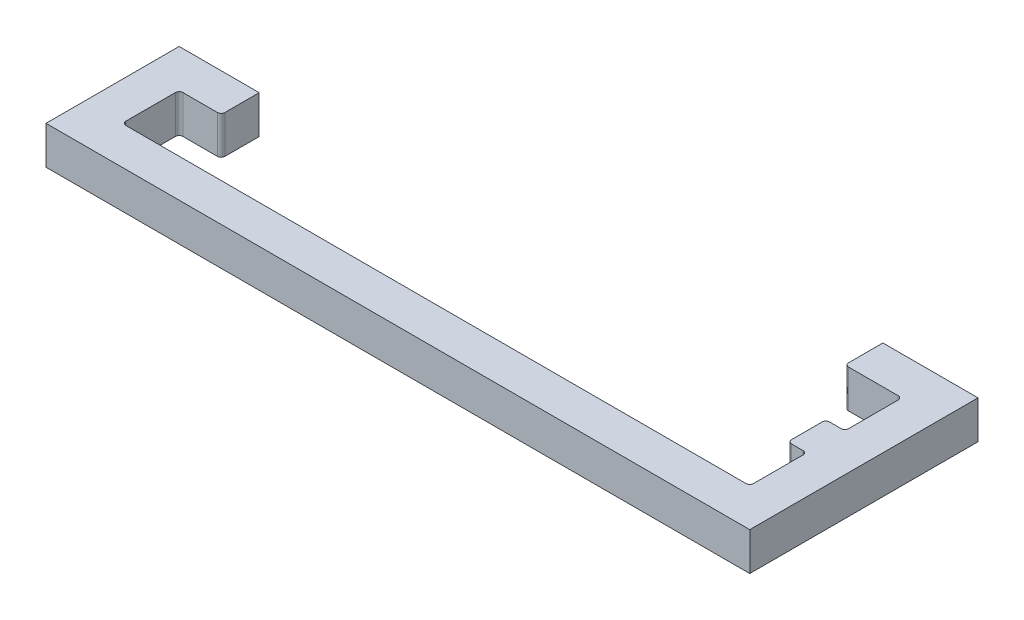
ISO-10303-21;
HEADER;
FILE_DESCRIPTION(('STEP AP214'),'2;1');
FILE_NAME('part.step','',(''),(''),'','','');
FILE_SCHEMA(('AUTOMOTIVE_DESIGN { 1 0 10303 214 1 1 1 1 }'));
ENDSEC;
DATA;
#1=APPLICATION_CONTEXT('core data for automotive mechanical design processes');
#2=APPLICATION_PROTOCOL_DEFINITION('international standard','automotive_design',2000,#1);
#3=PRODUCT_CONTEXT('',#1,'mechanical');
#4=PRODUCT('Part','Part','',(#3));
#5=PRODUCT_RELATED_PRODUCT_CATEGORY('part','',(#4));
#6=PRODUCT_DEFINITION_FORMATION('','',#4);
#7=PRODUCT_DEFINITION_CONTEXT('part definition',#1,'design');
#8=PRODUCT_DEFINITION('design','',#6,#7);
#9=PRODUCT_DEFINITION_SHAPE('','',#8);
#10=(LENGTH_UNIT() NAMED_UNIT(*) SI_UNIT(.MILLI.,.METRE.));
#11=(NAMED_UNIT(*) PLANE_ANGLE_UNIT() SI_UNIT($,.RADIAN.));
#12=(NAMED_UNIT(*) SI_UNIT($,.STERADIAN.) SOLID_ANGLE_UNIT());
#13=UNCERTAINTY_MEASURE_WITH_UNIT(LENGTH_MEASURE(1.E-05),#10,'distance_accuracy_value','');
#14=(GEOMETRIC_REPRESENTATION_CONTEXT(3) GLOBAL_UNCERTAINTY_ASSIGNED_CONTEXT((#13)) GLOBAL_UNIT_ASSIGNED_CONTEXT((#10,
#11,#12)) REPRESENTATION_CONTEXT('',''));
#15=CARTESIAN_POINT('',(0.,0.,0.));
#16=DIRECTION('',(0.,0.,1.));
#17=DIRECTION('',(1.,0.,0.));
#18=AXIS2_PLACEMENT_3D('',#15,#16,#17);
#19=CARTESIAN_POINT('',(0.,10.,-50.2919451204655));
#20=DIRECTION('',(0.,0.,1.));
#21=DIRECTION('',(1.,0.,0.));
#22=AXIS2_PLACEMENT_3D('',#19,#20,#21);
#23=PLANE('',#22);
#24=DIRECTION('',(-1.,0.,0.));
#25=VECTOR('',#24,1.);
#26=CARTESIAN_POINT('',(0.,0.,-50.2919451204655));
#27=LINE('',#26,#25);
#28=CARTESIAN_POINT('',(152.399069508023,0.,-50.2919451204655));
#29=VERTEX_POINT('',#28);
#30=CARTESIAN_POINT('',(127.399069508023,0.,-50.2919451204655));
#31=VERTEX_POINT('',#30);
#32=EDGE_CURVE('E235',#29,#31,#27,.T.);
#33=ORIENTED_EDGE('',*,*,#32,.T.);
#34=DIRECTION('',(0.,-1.,0.));
#35=VECTOR('',#34,1.);
#36=CARTESIAN_POINT('',(127.399069508023,10.,-50.2919451204655));
#37=LINE('',#36,#35);
#38=CARTESIAN_POINT('',(127.399069508023,10.,-50.2919451204655));
#39=VERTEX_POINT('',#38);
#40=EDGE_CURVE('E217',#39,#31,#37,.T.);
#41=ORIENTED_EDGE('',*,*,#40,.F.);
#42=DIRECTION('',(-1.,0.,0.));
#43=VECTOR('',#42,1.);
#44=CARTESIAN_POINT('',(0.,10.,-50.2919451204655));
#45=LINE('',#44,#43);
#46=CARTESIAN_POINT('',(152.399069508023,10.,-50.2919451204655));
#47=VERTEX_POINT('',#46);
#48=EDGE_CURVE('E223',#47,#39,#45,.T.);
#49=ORIENTED_EDGE('',*,*,#48,.F.);
#50=DIRECTION('',(0.,-1.,0.));
#51=VECTOR('',#50,1.);
#52=CARTESIAN_POINT('',(152.399069508023,10.,-50.2919451204655));
#53=LINE('',#52,#51);
#54=EDGE_CURVE('E362',#47,#29,#53,.T.);
#55=ORIENTED_EDGE('',*,*,#54,.T.);
#56=EDGE_LOOP('',(#33,#41,#49,#55));
#57=FACE_BOUND('',#56,.T.);
#58=ADVANCED_FACE('F37',(#57),#23,.F.);
#59=CARTESIAN_POINT('',(127.399069508023,10.,-3.5360345070907E-13));
#60=DIRECTION('',(1.,0.,0.));
#61=DIRECTION('',(0.,0.,-1.));
#62=AXIS2_PLACEMENT_3D('',#59,#60,#61);
#63=PLANE('',#62);
#64=DIRECTION('',(0.,0.,1.));
#65=VECTOR('',#64,1.);
#66=CARTESIAN_POINT('',(127.399069508023,0.,-3.5360345070907E-13));
#67=LINE('',#66,#65);
#68=CARTESIAN_POINT('',(127.399069508023,0.,-41.2919451204655));
#69=VERTEX_POINT('',#68);
#70=EDGE_CURVE('E364',#31,#69,#67,.T.);
#71=ORIENTED_EDGE('',*,*,#70,.T.);
#72=DIRECTION('',(0.,-1.,0.));
#73=VECTOR('',#72,1.);
#74=CARTESIAN_POINT('',(127.399069508023,10.,-41.2919451204655));
#75=LINE('',#74,#73);
#76=CARTESIAN_POINT('',(127.399069508023,10.,-41.2919451204655));
#77=VERTEX_POINT('',#76);
#78=EDGE_CURVE('E220',#69,#77,#75,.F.);
#79=ORIENTED_EDGE('',*,*,#78,.T.);
#80=DIRECTION('',(0.,0.,1.));
#81=VECTOR('',#80,1.);
#82=CARTESIAN_POINT('',(127.399069508023,10.,-3.5360345070907E-13));
#83=LINE('',#82,#81);
#84=EDGE_CURVE('E212',#39,#77,#83,.T.);
#85=ORIENTED_EDGE('',*,*,#84,.F.);
#86=ORIENTED_EDGE('',*,*,#40,.T.);
#87=EDGE_LOOP('',(#71,#79,#85,#86));
#88=FACE_BOUND('',#87,.T.);
#89=ADVANCED_FACE('F215',(#88),#63,.F.);
#90=CARTESIAN_POINT('',(0.,10.,-40.2919451204655));
#91=DIRECTION('',(0.,0.,1.));
#92=DIRECTION('',(1.,0.,0.));
#93=AXIS2_PLACEMENT_3D('',#90,#91,#92);
#94=PLANE('',#93);
#95=DIRECTION('',(-1.,0.,0.));
#96=VECTOR('',#95,1.);
#97=CARTESIAN_POINT('',(0.,0.,-40.2919451204655));
#98=LINE('',#97,#96);
#99=CARTESIAN_POINT('',(141.399069508023,0.,-40.2919451204655));
#100=VERTEX_POINT('',#99);
#101=CARTESIAN_POINT('',(128.399069508023,0.,-40.2919451204655));
#102=VERTEX_POINT('',#101);
#103=EDGE_CURVE('E366',#100,#102,#98,.T.);
#104=ORIENTED_EDGE('',*,*,#103,.F.);
#105=DIRECTION('',(0.,-1.,0.));
#106=VECTOR('',#105,1.);
#107=CARTESIAN_POINT('',(141.399069508023,10.,-40.2919451204655));
#108=LINE('',#107,#106);
#109=CARTESIAN_POINT('',(141.399069508023,10.,-40.2919451204655));
#110=VERTEX_POINT('',#109);
#111=EDGE_CURVE('E295',#100,#110,#108,.F.);
#112=ORIENTED_EDGE('',*,*,#111,.T.);
#113=DIRECTION('',(-1.,0.,0.));
#114=VECTOR('',#113,1.);
#115=CARTESIAN_POINT('',(0.,10.,-40.2919451204655));
#116=LINE('',#115,#114);
#117=CARTESIAN_POINT('',(128.399069508023,10.,-40.2919451204655));
#118=VERTEX_POINT('',#117);
#119=EDGE_CURVE('E222',#110,#118,#116,.T.);
#120=ORIENTED_EDGE('',*,*,#119,.T.);
#121=DIRECTION('',(0.,-1.,0.));
#122=VECTOR('',#121,1.);
#123=CARTESIAN_POINT('',(128.399069508023,0.,-40.2919451204655));
#124=LINE('',#123,#122);
#125=EDGE_CURVE('E292',#118,#102,#124,.T.);
#126=ORIENTED_EDGE('',*,*,#125,.T.);
#127=EDGE_LOOP('',(#104,#112,#120,#126));
#128=FACE_BOUND('',#127,.T.);
#129=ADVANCED_FACE('F428',(#128),#94,.T.);
#130=CARTESIAN_POINT('',(142.399069508023,10.,0.));
#131=DIRECTION('',(1.,0.,0.));
#132=DIRECTION('',(0.,0.,-1.));
#133=AXIS2_PLACEMENT_3D('',#130,#131,#132);
#134=PLANE('',#133);
#135=DIRECTION('',(0.,0.,1.));
#136=VECTOR('',#135,1.);
#137=CARTESIAN_POINT('',(142.399069508023,0.,0.));
#138=LINE('',#137,#136);
#139=CARTESIAN_POINT('',(142.399069508023,0.,-39.2919451204655));
#140=VERTEX_POINT('',#139);
#141=CARTESIAN_POINT('',(142.399069508023,0.,-26.2919451204655));
#142=VERTEX_POINT('',#141);
#143=EDGE_CURVE('E369',#140,#142,#138,.T.);
#144=ORIENTED_EDGE('',*,*,#143,.T.);
#145=DIRECTION('',(0.,-1.,0.));
#146=VECTOR('',#145,1.);
#147=CARTESIAN_POINT('',(142.399069508023,10.,-26.2919451204655));
#148=LINE('',#147,#146);
#149=CARTESIAN_POINT('',(142.399069508023,10.,-26.2919451204655));
#150=VERTEX_POINT('',#149);
#151=EDGE_CURVE('E290',#142,#150,#148,.F.);
#152=ORIENTED_EDGE('',*,*,#151,.T.);
#153=DIRECTION('',(0.,0.,1.));
#154=VECTOR('',#153,1.);
#155=CARTESIAN_POINT('',(142.399069508023,10.,0.));
#156=LINE('',#155,#154);
#157=CARTESIAN_POINT('',(142.399069508023,10.,-39.2919451204655));
#158=VERTEX_POINT('',#157);
#159=EDGE_CURVE('E471',#158,#150,#156,.T.);
#160=ORIENTED_EDGE('',*,*,#159,.F.);
#161=DIRECTION('',(0.,-1.,0.));
#162=VECTOR('',#161,1.);
#163=CARTESIAN_POINT('',(142.399069508023,10.,-39.2919451204655));
#164=LINE('',#163,#162);
#165=EDGE_CURVE('E287',#158,#140,#164,.T.);
#166=ORIENTED_EDGE('',*,*,#165,.T.);
#167=EDGE_LOOP('',(#144,#152,#160,#166));
#168=FACE_BOUND('',#167,.T.);
#169=ADVANCED_FACE('F525',(#168),#134,.F.);
#170=CARTESIAN_POINT('',(0.,10.,-25.2919451204655));
#171=DIRECTION('',(0.,0.,-1.));
#172=DIRECTION('',(-1.,0.,0.));
#173=AXIS2_PLACEMENT_3D('',#170,#171,#172);
#174=PLANE('',#173);
#175=DIRECTION('',(1.,0.,0.));
#176=VECTOR('',#175,1.);
#177=CARTESIAN_POINT('',(0.,0.,-25.2919451204655));
#178=LINE('',#177,#176);
#179=CARTESIAN_POINT('',(138.399069508023,0.,-25.2919451204655));
#180=VERTEX_POINT('',#179);
#181=CARTESIAN_POINT('',(141.399069508023,0.,-25.2919451204655));
#182=VERTEX_POINT('',#181);
#183=EDGE_CURVE('E372',#180,#182,#178,.T.);
#184=ORIENTED_EDGE('',*,*,#183,.F.);
#185=DIRECTION('',(0.,-1.,0.));
#186=VECTOR('',#185,1.);
#187=CARTESIAN_POINT('',(138.399069508023,10.,-25.2919451204655));
#188=LINE('',#187,#186);
#189=CARTESIAN_POINT('',(138.399069508023,10.,-25.2919451204655));
#190=VERTEX_POINT('',#189);
#191=EDGE_CURVE('E278',#180,#190,#188,.F.);
#192=ORIENTED_EDGE('',*,*,#191,.T.);
#193=DIRECTION('',(1.,0.,0.));
#194=VECTOR('',#193,1.);
#195=CARTESIAN_POINT('',(0.,10.,-25.2919451204655));
#196=LINE('',#195,#194);
#197=CARTESIAN_POINT('',(141.399069508023,10.,-25.2919451204655));
#198=VERTEX_POINT('',#197);
#199=EDGE_CURVE('E474',#190,#198,#196,.T.);
#200=ORIENTED_EDGE('',*,*,#199,.T.);
#201=DIRECTION('',(0.,-1.,0.));
#202=VECTOR('',#201,1.);
#203=CARTESIAN_POINT('',(141.399069508023,10.,-25.2919451204655));
#204=LINE('',#203,#202);
#205=EDGE_CURVE('E275',#198,#182,#204,.T.);
#206=ORIENTED_EDGE('',*,*,#205,.T.);
#207=EDGE_LOOP('',(#184,#192,#200,#206));
#208=FACE_BOUND('',#207,.T.);
#209=ADVANCED_FACE('F519',(#208),#174,.T.);
#210=CARTESIAN_POINT('',(137.399069508023,10.,0.));
#211=DIRECTION('',(1.,0.,0.));
#212=DIRECTION('',(0.,0.,-1.));
#213=AXIS2_PLACEMENT_3D('',#210,#211,#212);
#214=PLANE('',#213);
#215=DIRECTION('',(0.,0.,1.));
#216=VECTOR('',#215,1.);
#217=CARTESIAN_POINT('',(137.399069508023,10.,0.));
#218=LINE('',#217,#216);
#219=CARTESIAN_POINT('',(137.399069508023,10.,-24.2919451204655));
#220=VERTEX_POINT('',#219);
#221=CARTESIAN_POINT('',(137.399069508023,10.,-16.2919451204655));
#222=VERTEX_POINT('',#221);
#223=EDGE_CURVE('E480',#220,#222,#218,.T.);
#224=ORIENTED_EDGE('',*,*,#223,.F.);
#225=DIRECTION('',(0.,-1.,0.));
#226=VECTOR('',#225,1.);
#227=CARTESIAN_POINT('',(137.399069508023,0.,-24.2919451204655));
#228=LINE('',#227,#226);
#229=CARTESIAN_POINT('',(137.399069508023,0.,-24.2919451204655));
#230=VERTEX_POINT('',#229);
#231=EDGE_CURVE('E264',#220,#230,#228,.T.);
#232=ORIENTED_EDGE('',*,*,#231,.T.);
#233=DIRECTION('',(0.,0.,1.));
#234=VECTOR('',#233,1.);
#235=CARTESIAN_POINT('',(137.399069508023,0.,0.));
#236=LINE('',#235,#234);
#237=CARTESIAN_POINT('',(137.399069508023,0.,-16.2919451204655));
#238=VERTEX_POINT('',#237);
#239=EDGE_CURVE('E376',#230,#238,#236,.T.);
#240=ORIENTED_EDGE('',*,*,#239,.T.);
#241=DIRECTION('',(0.,-1.,0.));
#242=VECTOR('',#241,1.);
#243=CARTESIAN_POINT('',(137.399069508023,10.,-16.2919451204655));
#244=LINE('',#243,#242);
#245=EDGE_CURVE('E262',#238,#222,#244,.F.);
#246=ORIENTED_EDGE('',*,*,#245,.T.);
#247=EDGE_LOOP('',(#224,#232,#240,#246));
#248=FACE_BOUND('',#247,.T.);
#249=ADVANCED_FACE('F513',(#248),#214,.F.);
#250=CARTESIAN_POINT('',(0.,10.,-15.2919451204655));
#251=DIRECTION('',(0.,0.,-1.));
#252=DIRECTION('',(-1.,0.,0.));
#253=AXIS2_PLACEMENT_3D('',#250,#251,#252);
#254=PLANE('',#253);
#255=DIRECTION('',(1.,0.,0.));
#256=VECTOR('',#255,1.);
#257=CARTESIAN_POINT('',(0.,0.,-15.2919451204655));
#258=LINE('',#257,#256);
#259=CARTESIAN_POINT('',(138.399069508023,0.,-15.2919451204655));
#260=VERTEX_POINT('',#259);
#261=CARTESIAN_POINT('',(141.399069508023,0.,-15.2919451204655));
#262=VERTEX_POINT('',#261);
#263=EDGE_CURVE('E379',#260,#262,#258,.T.);
#264=ORIENTED_EDGE('',*,*,#263,.T.);
#265=DIRECTION('',(0.,-1.,0.));
#266=VECTOR('',#265,1.);
#267=CARTESIAN_POINT('',(141.399069508023,10.,-15.2919451204655));
#268=LINE('',#267,#266);
#269=CARTESIAN_POINT('',(141.399069508023,10.,-15.2919451204655));
#270=VERTEX_POINT('',#269);
#271=EDGE_CURVE('E260',#262,#270,#268,.F.);
#272=ORIENTED_EDGE('',*,*,#271,.T.);
#273=DIRECTION('',(1.,0.,0.));
#274=VECTOR('',#273,1.);
#275=CARTESIAN_POINT('',(0.,10.,-15.2919451204655));
#276=LINE('',#275,#274);
#277=CARTESIAN_POINT('',(138.399069508023,10.,-15.2919451204655));
#278=VERTEX_POINT('',#277);
#279=EDGE_CURVE('E483',#278,#270,#276,.T.);
#280=ORIENTED_EDGE('',*,*,#279,.F.);
#281=DIRECTION('',(0.,-1.,0.));
#282=VECTOR('',#281,1.);
#283=CARTESIAN_POINT('',(138.399069508023,10.,-15.2919451204655));
#284=LINE('',#283,#282);
#285=EDGE_CURVE('E257',#278,#260,#284,.T.);
#286=ORIENTED_EDGE('',*,*,#285,.T.);
#287=EDGE_LOOP('',(#264,#272,#280,#286));
#288=FACE_BOUND('',#287,.T.);
#289=ADVANCED_FACE('F506',(#288),#254,.F.);
#290=CARTESIAN_POINT('',(142.399069508023,0.,-14.2919451204655));
#291=VERTEX_POINT('',#290);
#292=CARTESIAN_POINT('',(142.399069508023,0.,-1.29194512046552));
#293=VERTEX_POINT('',#292);
#294=EDGE_CURVE('E373',#291,#293,#138,.T.);
#295=ORIENTED_EDGE('',*,*,#294,.T.);
#296=DIRECTION('',(0.,-1.,0.));
#297=VECTOR('',#296,1.);
#298=CARTESIAN_POINT('',(142.399069508023,10.,-1.29194512046552));
#299=LINE('',#298,#297);
#300=CARTESIAN_POINT('',(142.399069508023,10.,-1.29194512046552));
#301=VERTEX_POINT('',#300);
#302=EDGE_CURVE('E255',#293,#301,#299,.F.);
#303=ORIENTED_EDGE('',*,*,#302,.T.);
#304=CARTESIAN_POINT('',(142.399069508023,10.,-14.2919451204655));
#305=VERTEX_POINT('',#304);
#306=EDGE_CURVE('E476',#305,#301,#156,.T.);
#307=ORIENTED_EDGE('',*,*,#306,.F.);
#308=DIRECTION('',(0.,-1.,0.));
#309=VECTOR('',#308,1.);
#310=CARTESIAN_POINT('',(142.399069508023,0.,-14.2919451204655));
#311=LINE('',#310,#309);
#312=EDGE_CURVE('E252',#305,#291,#311,.T.);
#313=ORIENTED_EDGE('',*,*,#312,.T.);
#314=EDGE_LOOP('',(#295,#303,#307,#313));
#315=FACE_BOUND('',#314,.T.);
#316=ADVANCED_FACE('F502',(#315),#134,.F.);
#317=CARTESIAN_POINT('',(0.,10.,-0.29194512046552));
#318=DIRECTION('',(0.,0.,-1.));
#319=DIRECTION('',(-1.,0.,0.));
#320=AXIS2_PLACEMENT_3D('',#317,#318,#319);
#321=PLANE('',#320);
#322=DIRECTION('',(1.,0.,0.));
#323=VECTOR('',#322,1.);
#324=CARTESIAN_POINT('',(0.,0.,-0.29194512046552));
#325=LINE('',#324,#323);
#326=CARTESIAN_POINT('',(-21.6009304919769,0.,-0.29194512046552));
#327=VERTEX_POINT('',#326);
#328=CARTESIAN_POINT('',(141.399069508023,0.,-0.29194512046552));
#329=VERTEX_POINT('',#328);
#330=EDGE_CURVE('E340',#327,#329,#325,.T.);
#331=ORIENTED_EDGE('',*,*,#330,.F.);
#332=DIRECTION('',(0.,-1.,0.));
#333=VECTOR('',#332,1.);
#334=CARTESIAN_POINT('',(-21.6009304919769,10.,-0.29194512046552));
#335=LINE('',#334,#333);
#336=CARTESIAN_POINT('',(-21.6009304919769,10.,-0.29194512046552));
#337=VERTEX_POINT('',#336);
#338=EDGE_CURVE('E250',#327,#337,#335,.F.);
#339=ORIENTED_EDGE('',*,*,#338,.T.);
#340=DIRECTION('',(1.,0.,0.));
#341=VECTOR('',#340,1.);
#342=CARTESIAN_POINT('',(0.,10.,-0.29194512046552));
#343=LINE('',#342,#341);
#344=CARTESIAN_POINT('',(141.399069508023,10.,-0.29194512046552));
#345=VERTEX_POINT('',#344);
#346=EDGE_CURVE('E351',#337,#345,#343,.T.);
#347=ORIENTED_EDGE('',*,*,#346,.T.);
#348=DIRECTION('',(0.,-1.,0.));
#349=VECTOR('',#348,1.);
#350=CARTESIAN_POINT('',(141.399069508023,10.,-0.29194512046552));
#351=LINE('',#350,#349);
#352=EDGE_CURVE('E247',#345,#329,#351,.T.);
#353=ORIENTED_EDGE('',*,*,#352,.T.);
#354=EDGE_LOOP('',(#331,#339,#347,#353));
#355=FACE_BOUND('',#354,.T.);
#356=ADVANCED_FACE('F497',(#355),#321,.T.);
#357=CARTESIAN_POINT('',(-22.6009304919769,10.,0.));
#358=DIRECTION('',(1.,0.,0.));
#359=DIRECTION('',(0.,0.,-1.));
#360=AXIS2_PLACEMENT_3D('',#357,#358,#359);
#361=PLANE('',#360);
#362=DIRECTION('',(0.,0.,1.));
#363=VECTOR('',#362,1.);
#364=CARTESIAN_POINT('',(-22.6009304919769,10.,0.));
#365=LINE('',#364,#363);
#366=CARTESIAN_POINT('',(-22.600930491977,10.,-14.2919451204655));
#367=VERTEX_POINT('',#366);
#368=CARTESIAN_POINT('',(-22.6009304919769,10.,-1.29194512046552));
#369=VERTEX_POINT('',#368);
#370=EDGE_CURVE('E345',#367,#369,#365,.T.);
#371=ORIENTED_EDGE('',*,*,#370,.T.);
#372=DIRECTION('',(0.,-1.,0.));
#373=VECTOR('',#372,1.);
#374=CARTESIAN_POINT('',(-22.6009304919769,0.,-1.29194512046552));
#375=LINE('',#374,#373);
#376=CARTESIAN_POINT('',(-22.6009304919769,0.,-1.29194512046552));
#377=VERTEX_POINT('',#376);
#378=EDGE_CURVE('E239',#369,#377,#375,.T.);
#379=ORIENTED_EDGE('',*,*,#378,.T.);
#380=DIRECTION('',(0.,0.,1.));
#381=VECTOR('',#380,1.);
#382=CARTESIAN_POINT('',(-22.6009304919769,0.,0.));
#383=LINE('',#382,#381);
#384=CARTESIAN_POINT('',(-22.600930491977,0.,-14.2919451204655));
#385=VERTEX_POINT('',#384);
#386=EDGE_CURVE('E330',#385,#377,#383,.T.);
#387=ORIENTED_EDGE('',*,*,#386,.F.);
#388=DIRECTION('',(0.,-1.,0.));
#389=VECTOR('',#388,1.);
#390=CARTESIAN_POINT('',(-22.600930491977,10.,-14.2919451204655));
#391=LINE('',#390,#389);
#392=EDGE_CURVE('E236',#385,#367,#391,.F.);
#393=ORIENTED_EDGE('',*,*,#392,.T.);
#394=EDGE_LOOP('',(#371,#379,#387,#393));
#395=FACE_BOUND('',#394,.T.);
#396=ADVANCED_FACE('F337',(#395),#361,.T.);
#397=CARTESIAN_POINT('',(0.,10.,-15.2919451204655));
#398=DIRECTION('',(0.,0.,-1.));
#399=DIRECTION('',(-1.,0.,0.));
#400=AXIS2_PLACEMENT_3D('',#397,#398,#399);
#401=PLANE('',#400);
#402=DIRECTION('',(1.,0.,0.));
#403=VECTOR('',#402,1.);
#404=CARTESIAN_POINT('',(0.,10.,-15.2919451204655));
#405=LINE('',#404,#403);
#406=CARTESIAN_POINT('',(-21.600930491977,10.,-15.2919451204655));
#407=VERTEX_POINT('',#406);
#408=CARTESIAN_POINT('',(-12.5570391211641,10.,-15.2919451204655));
#409=VERTEX_POINT('',#408);
#410=EDGE_CURVE('E344',#407,#409,#405,.T.);
#411=ORIENTED_EDGE('',*,*,#410,.F.);
#412=DIRECTION('',(0.,-1.,0.));
#413=VECTOR('',#412,1.);
#414=CARTESIAN_POINT('',(-21.600930491977,10.,-15.2919451204655));
#415=LINE('',#414,#413);
#416=CARTESIAN_POINT('',(-21.600930491977,0.,-15.2919451204655));
#417=VERTEX_POINT('',#416);
#418=EDGE_CURVE('E299',#407,#417,#415,.T.);
#419=ORIENTED_EDGE('',*,*,#418,.T.);
#420=DIRECTION('',(1.,0.,0.));
#421=VECTOR('',#420,1.);
#422=CARTESIAN_POINT('',(0.,0.,-15.2919451204655));
#423=LINE('',#422,#421);
#424=CARTESIAN_POINT('',(-12.5570391211641,0.,-15.2919451204655));
#425=VERTEX_POINT('',#424);
#426=EDGE_CURVE('E331',#417,#425,#423,.T.);
#427=ORIENTED_EDGE('',*,*,#426,.T.);
#428=DIRECTION('',(0.,-1.,0.));
#429=VECTOR('',#428,1.);
#430=CARTESIAN_POINT('',(-12.5570391211641,10.,-15.2919451204655));
#431=LINE('',#430,#429);
#432=EDGE_CURVE('E60',#425,#409,#431,.F.);
#433=ORIENTED_EDGE('',*,*,#432,.T.);
#434=EDGE_LOOP('',(#411,#419,#427,#433));
#435=FACE_BOUND('',#434,.T.);
#436=ADVANCED_FACE('F346',(#435),#401,.F.);
#437=CARTESIAN_POINT('',(-11.5570391211641,10.,0.));
#438=DIRECTION('',(1.,0.,0.));
#439=DIRECTION('',(0.,0.,-1.));
#440=AXIS2_PLACEMENT_3D('',#437,#438,#439);
#441=PLANE('',#440);
#442=DIRECTION('',(0.,0.,1.));
#443=VECTOR('',#442,1.);
#444=CARTESIAN_POINT('',(-11.5570391211641,10.,0.));
#445=LINE('',#444,#443);
#446=CARTESIAN_POINT('',(-11.5570391211641,10.,-25.2919451204655));
#447=VERTEX_POINT('',#446);
#448=CARTESIAN_POINT('',(-11.5570391211641,10.,-16.2919451204655));
#449=VERTEX_POINT('',#448);
#450=EDGE_CURVE('E347',#447,#449,#445,.T.);
#451=ORIENTED_EDGE('',*,*,#450,.T.);
#452=DIRECTION('',(0.,-1.,0.));
#453=VECTOR('',#452,1.);
#454=CARTESIAN_POINT('',(-11.5570391211641,0.,-16.2919451204655));
#455=LINE('',#454,#453);
#456=CARTESIAN_POINT('',(-11.5570391211641,0.,-16.2919451204655));
#457=VERTEX_POINT('',#456);
#458=EDGE_CURVE('E302',#449,#457,#455,.T.);
#459=ORIENTED_EDGE('',*,*,#458,.T.);
#460=DIRECTION('',(0.,0.,1.));
#461=VECTOR('',#460,1.);
#462=CARTESIAN_POINT('',(-11.5570391211641,0.,0.));
#463=LINE('',#462,#461);
#464=CARTESIAN_POINT('',(-11.5570391211641,0.,-25.2919451204655));
#465=VERTEX_POINT('',#464);
#466=EDGE_CURVE('E385',#465,#457,#463,.T.);
#467=ORIENTED_EDGE('',*,*,#466,.F.);
#468=DIRECTION('',(0.,-1.,0.));
#469=VECTOR('',#468,1.);
#470=CARTESIAN_POINT('',(-11.5570391211641,10.,-25.2919451204655));
#471=LINE('',#470,#469);
#472=EDGE_CURVE('E237',#447,#465,#471,.T.);
#473=ORIENTED_EDGE('',*,*,#472,.F.);
#474=EDGE_LOOP('',(#451,#459,#467,#473));
#475=FACE_BOUND('',#474,.T.);
#476=ADVANCED_FACE('F415',(#475),#441,.T.);
#477=CARTESIAN_POINT('',(0.,10.,-25.2919451204655));
#478=DIRECTION('',(0.,0.,-1.));
#479=DIRECTION('',(-1.,0.,0.));
#480=AXIS2_PLACEMENT_3D('',#477,#478,#479);
#481=PLANE('',#480);
#482=DIRECTION('',(1.,0.,0.));
#483=VECTOR('',#482,1.);
#484=CARTESIAN_POINT('',(0.,0.,-25.2919451204655));
#485=LINE('',#484,#483);
#486=CARTESIAN_POINT('',(-32.6009304919769,0.,-25.2919451204655));
#487=VERTEX_POINT('',#486);
#488=EDGE_CURVE('E388',#487,#465,#485,.T.);
#489=ORIENTED_EDGE('',*,*,#488,.F.);
#490=DIRECTION('',(0.,-1.,0.));
#491=VECTOR('',#490,1.);
#492=CARTESIAN_POINT('',(-32.6009304919769,10.,-25.2919451204655));
#493=LINE('',#492,#491);
#494=CARTESIAN_POINT('',(-32.6009304919769,10.,-25.2919451204655));
#495=VERTEX_POINT('',#494);
#496=EDGE_CURVE('E241',#495,#487,#493,.T.);
#497=ORIENTED_EDGE('',*,*,#496,.F.);
#498=DIRECTION('',(1.,0.,0.));
#499=VECTOR('',#498,1.);
#500=CARTESIAN_POINT('',(0.,10.,-25.2919451204655));
#501=LINE('',#500,#499);
#502=EDGE_CURVE('E349',#495,#447,#501,.T.);
#503=ORIENTED_EDGE('',*,*,#502,.T.);
#504=ORIENTED_EDGE('',*,*,#472,.T.);
#505=EDGE_LOOP('',(#489,#497,#503,#504));
#506=FACE_BOUND('',#505,.T.);
#507=ADVANCED_FACE('F412',(#506),#481,.T.);
#508=CARTESIAN_POINT('',(-32.6009304919769,10.,0.));
#509=DIRECTION('',(1.,0.,0.));
#510=DIRECTION('',(0.,0.,-1.));
#511=AXIS2_PLACEMENT_3D('',#508,#509,#510);
#512=PLANE('',#511);
#513=DIRECTION('',(0.,0.,1.));
#514=VECTOR('',#513,1.);
#515=CARTESIAN_POINT('',(-32.6009304919769,0.,0.));
#516=LINE('',#515,#514);
#517=CARTESIAN_POINT('',(-32.6009304919769,0.,9.70805487953448));
#518=VERTEX_POINT('',#517);
#519=EDGE_CURVE('E391',#487,#518,#516,.T.);
#520=ORIENTED_EDGE('',*,*,#519,.T.);
#521=DIRECTION('',(0.,-1.,0.));
#522=VECTOR('',#521,1.);
#523=CARTESIAN_POINT('',(-32.6009304919769,10.,9.70805487953448));
#524=LINE('',#523,#522);
#525=CARTESIAN_POINT('',(-32.6009304919769,10.,9.70805487953448));
#526=VERTEX_POINT('',#525);
#527=EDGE_CURVE('E401',#526,#518,#524,.T.);
#528=ORIENTED_EDGE('',*,*,#527,.F.);
#529=DIRECTION('',(0.,0.,1.));
#530=VECTOR('',#529,1.);
#531=CARTESIAN_POINT('',(-32.6009304919769,10.,0.));
#532=LINE('',#531,#530);
#533=EDGE_CURVE('E357',#495,#526,#532,.T.);
#534=ORIENTED_EDGE('',*,*,#533,.F.);
#535=ORIENTED_EDGE('',*,*,#496,.T.);
#536=EDGE_LOOP('',(#520,#528,#534,#535));
#537=FACE_BOUND('',#536,.T.);
#538=ADVANCED_FACE('F406',(#537),#512,.F.);
#539=CARTESIAN_POINT('',(0.,10.,9.70805487953448));
#540=DIRECTION('',(0.,0.,-1.));
#541=DIRECTION('',(-1.,0.,0.));
#542=AXIS2_PLACEMENT_3D('',#539,#540,#541);
#543=PLANE('',#542);
#544=DIRECTION('',(1.,0.,0.));
#545=VECTOR('',#544,1.);
#546=CARTESIAN_POINT('',(0.,0.,9.70805487953448));
#547=LINE('',#546,#545);
#548=CARTESIAN_POINT('',(152.399069508023,0.,9.70805487953448));
#549=VERTEX_POINT('',#548);
#550=EDGE_CURVE('E393',#518,#549,#547,.T.);
#551=ORIENTED_EDGE('',*,*,#550,.T.);
#552=DIRECTION('',(0.,-1.,0.));
#553=VECTOR('',#552,1.);
#554=CARTESIAN_POINT('',(152.399069508023,10.,9.70805487953448));
#555=LINE('',#554,#553);
#556=CARTESIAN_POINT('',(152.399069508023,10.,9.70805487953448));
#557=VERTEX_POINT('',#556);
#558=EDGE_CURVE('E399',#557,#549,#555,.T.);
#559=ORIENTED_EDGE('',*,*,#558,.F.);
#560=DIRECTION('',(1.,0.,0.));
#561=VECTOR('',#560,1.);
#562=CARTESIAN_POINT('',(0.,10.,9.70805487953448));
#563=LINE('',#562,#561);
#564=EDGE_CURVE('E359',#526,#557,#563,.T.);
#565=ORIENTED_EDGE('',*,*,#564,.F.);
#566=ORIENTED_EDGE('',*,*,#527,.T.);
#567=EDGE_LOOP('',(#551,#559,#565,#566));
#568=FACE_BOUND('',#567,.T.);
#569=ADVANCED_FACE('F534',(#568),#543,.F.);
#570=CARTESIAN_POINT('',(152.399069508023,10.,0.));
#571=DIRECTION('',(1.,0.,0.));
#572=DIRECTION('',(0.,0.,-1.));
#573=AXIS2_PLACEMENT_3D('',#570,#571,#572);
#574=PLANE('',#573);
#575=DIRECTION('',(0.,0.,1.));
#576=VECTOR('',#575,1.);
#577=CARTESIAN_POINT('',(152.399069508023,0.,0.));
#578=LINE('',#577,#576);
#579=EDGE_CURVE('E232',#29,#549,#578,.T.);
#580=ORIENTED_EDGE('',*,*,#579,.F.);
#581=ORIENTED_EDGE('',*,*,#54,.F.);
#582=DIRECTION('',(0.,0.,1.));
#583=VECTOR('',#582,1.);
#584=CARTESIAN_POINT('',(152.399069508023,10.,0.));
#585=LINE('',#584,#583);
#586=EDGE_CURVE('E230',#47,#557,#585,.T.);
#587=ORIENTED_EDGE('',*,*,#586,.T.);
#588=ORIENTED_EDGE('',*,*,#558,.T.);
#589=EDGE_LOOP('',(#580,#581,#587,#588));
#590=FACE_BOUND('',#589,.T.);
#591=ADVANCED_FACE('F530',(#590),#574,.T.);
#592=CARTESIAN_POINT('',(0.,10.,0.));
#593=DIRECTION('',(0.,1.,0.));
#594=DIRECTION('',(0.,0.,1.));
#595=AXIS2_PLACEMENT_3D('',#592,#593,#594);
#596=PLANE('',#595);
#597=ORIENTED_EDGE('',*,*,#199,.F.);
#598=CARTESIAN_POINT('',(138.399069508023,10.,-24.2919451204655));
#599=DIRECTION('',(0.,1.,0.));
#600=DIRECTION('',(0.,0.,1.));
#601=AXIS2_PLACEMENT_3D('',#598,#599,#600);
#602=CIRCLE('',#601,1.);
#603=EDGE_CURVE('E285',#190,#220,#602,.T.);
#604=ORIENTED_EDGE('',*,*,#603,.T.);
#605=ORIENTED_EDGE('',*,*,#223,.T.);
#606=CARTESIAN_POINT('',(138.399069508023,10.,-16.2919451204655));
#607=DIRECTION('',(0.,1.,0.));
#608=DIRECTION('',(0.,0.,1.));
#609=AXIS2_PLACEMENT_3D('',#606,#607,#608);
#610=CIRCLE('',#609,1.);
#611=EDGE_CURVE('E283',#222,#278,#610,.T.);
#612=ORIENTED_EDGE('',*,*,#611,.T.);
#613=ORIENTED_EDGE('',*,*,#279,.T.);
#614=CARTESIAN_POINT('',(141.399069508023,10.,-14.2919451204655));
#615=DIRECTION('',(0.,1.,0.));
#616=DIRECTION('',(0.,0.,1.));
#617=AXIS2_PLACEMENT_3D('',#614,#615,#616);
#618=CIRCLE('',#617,1.);
#619=EDGE_CURVE('E315',#270,#305,#618,.F.);
#620=ORIENTED_EDGE('',*,*,#619,.T.);
#621=ORIENTED_EDGE('',*,*,#306,.T.);
#622=CARTESIAN_POINT('',(141.399069508023,10.,-1.29194512046552));
#623=DIRECTION('',(0.,1.,0.));
#624=DIRECTION('',(0.,0.,1.));
#625=AXIS2_PLACEMENT_3D('',#622,#623,#624);
#626=CIRCLE('',#625,1.);
#627=EDGE_CURVE('E311',#301,#345,#626,.F.);
#628=ORIENTED_EDGE('',*,*,#627,.T.);
#629=ORIENTED_EDGE('',*,*,#346,.F.);
#630=CARTESIAN_POINT('',(-21.6009304919769,10.,-1.29194512046552));
#631=DIRECTION('',(0.,1.,0.));
#632=DIRECTION('',(0.,0.,1.));
#633=AXIS2_PLACEMENT_3D('',#630,#631,#632);
#634=CIRCLE('',#633,1.);
#635=EDGE_CURVE('E307',#337,#369,#634,.F.);
#636=ORIENTED_EDGE('',*,*,#635,.T.);
#637=ORIENTED_EDGE('',*,*,#370,.F.);
#638=CARTESIAN_POINT('',(-21.600930491977,10.,-14.2919451204655));
#639=DIRECTION('',(0.,1.,0.));
#640=DIRECTION('',(0.,0.,1.));
#641=AXIS2_PLACEMENT_3D('',#638,#639,#640);
#642=CIRCLE('',#641,1.);
#643=EDGE_CURVE('E11',#367,#407,#642,.F.);
#644=ORIENTED_EDGE('',*,*,#643,.T.);
#645=ORIENTED_EDGE('',*,*,#410,.T.);
#646=CARTESIAN_POINT('',(-12.5570391211641,10.,-16.2919451204655));
#647=DIRECTION('',(0.,1.,0.));
#648=DIRECTION('',(0.,0.,1.));
#649=AXIS2_PLACEMENT_3D('',#646,#647,#648);
#650=CIRCLE('',#649,1.);
#651=EDGE_CURVE('E52',#409,#449,#650,.T.);
#652=ORIENTED_EDGE('',*,*,#651,.T.);
#653=ORIENTED_EDGE('',*,*,#450,.F.);
#654=ORIENTED_EDGE('',*,*,#502,.F.);
#655=ORIENTED_EDGE('',*,*,#533,.T.);
#656=ORIENTED_EDGE('',*,*,#564,.T.);
#657=ORIENTED_EDGE('',*,*,#586,.F.);
#658=ORIENTED_EDGE('',*,*,#48,.T.);
#659=ORIENTED_EDGE('',*,*,#84,.T.);
#660=CARTESIAN_POINT('',(128.399069508023,10.,-41.2919451204655));
#661=DIRECTION('',(0.,1.,0.));
#662=DIRECTION('',(0.,0.,1.));
#663=AXIS2_PLACEMENT_3D('',#660,#661,#662);
#664=CIRCLE('',#663,1.);
#665=EDGE_CURVE('E281',#77,#118,#664,.T.);
#666=ORIENTED_EDGE('',*,*,#665,.T.);
#667=ORIENTED_EDGE('',*,*,#119,.F.);
#668=CARTESIAN_POINT('',(141.399069508023,10.,-39.2919451204655));
#669=DIRECTION('',(0.,1.,0.));
#670=DIRECTION('',(0.,0.,1.));
#671=AXIS2_PLACEMENT_3D('',#668,#669,#670);
#672=CIRCLE('',#671,1.);
#673=EDGE_CURVE('E323',#110,#158,#672,.F.);
#674=ORIENTED_EDGE('',*,*,#673,.T.);
#675=ORIENTED_EDGE('',*,*,#159,.T.);
#676=CARTESIAN_POINT('',(141.399069508023,10.,-26.2919451204655));
#677=DIRECTION('',(0.,1.,0.));
#678=DIRECTION('',(0.,0.,1.));
#679=AXIS2_PLACEMENT_3D('',#676,#677,#678);
#680=CIRCLE('',#679,1.);
#681=EDGE_CURVE('E319',#150,#198,#680,.F.);
#682=ORIENTED_EDGE('',*,*,#681,.T.);
#683=EDGE_LOOP('',(#597,#604,#605,#612,#613,#620,#621,#628,#629,#636,#637,#644,#645,#652,#653,
#654,#655,#656,#657,#658,#659,#666,#667,#674,#675,#682));
#684=FACE_BOUND('',#683,.T.);
#685=ADVANCED_FACE('F228',(#684),#596,.T.);
#686=CARTESIAN_POINT('',(0.,0.,0.));
#687=DIRECTION('',(0.,1.,0.));
#688=DIRECTION('',(0.,0.,1.));
#689=AXIS2_PLACEMENT_3D('',#686,#687,#688);
#690=PLANE('',#689);
#691=ORIENTED_EDGE('',*,*,#239,.F.);
#692=CARTESIAN_POINT('',(138.399069508023,0.,-24.2919451204655));
#693=DIRECTION('',(0.,1.,0.));
#694=DIRECTION('',(0.,0.,1.));
#695=AXIS2_PLACEMENT_3D('',#692,#693,#694);
#696=CIRCLE('',#695,1.);
#697=EDGE_CURVE('E273',#230,#180,#696,.F.);
#698=ORIENTED_EDGE('',*,*,#697,.T.);
#699=ORIENTED_EDGE('',*,*,#183,.T.);
#700=CARTESIAN_POINT('',(141.399069508023,0.,-26.2919451204655));
#701=DIRECTION('',(0.,1.,0.));
#702=DIRECTION('',(0.,0.,1.));
#703=AXIS2_PLACEMENT_3D('',#700,#701,#702);
#704=CIRCLE('',#703,1.);
#705=EDGE_CURVE('E317',#182,#142,#704,.T.);
#706=ORIENTED_EDGE('',*,*,#705,.T.);
#707=ORIENTED_EDGE('',*,*,#143,.F.);
#708=CARTESIAN_POINT('',(141.399069508023,0.,-39.2919451204655));
#709=DIRECTION('',(0.,1.,0.));
#710=DIRECTION('',(0.,0.,1.));
#711=AXIS2_PLACEMENT_3D('',#708,#709,#710);
#712=CIRCLE('',#711,1.);
#713=EDGE_CURVE('E321',#140,#100,#712,.T.);
#714=ORIENTED_EDGE('',*,*,#713,.T.);
#715=ORIENTED_EDGE('',*,*,#103,.T.);
#716=CARTESIAN_POINT('',(128.399069508023,0.,-41.2919451204655));
#717=DIRECTION('',(0.,1.,0.));
#718=DIRECTION('',(0.,0.,1.));
#719=AXIS2_PLACEMENT_3D('',#716,#717,#718);
#720=CIRCLE('',#719,1.);
#721=EDGE_CURVE('E269',#102,#69,#720,.F.);
#722=ORIENTED_EDGE('',*,*,#721,.T.);
#723=ORIENTED_EDGE('',*,*,#70,.F.);
#724=ORIENTED_EDGE('',*,*,#32,.F.);
#725=ORIENTED_EDGE('',*,*,#579,.T.);
#726=ORIENTED_EDGE('',*,*,#550,.F.);
#727=ORIENTED_EDGE('',*,*,#519,.F.);
#728=ORIENTED_EDGE('',*,*,#488,.T.);
#729=ORIENTED_EDGE('',*,*,#466,.T.);
#730=CARTESIAN_POINT('',(-12.5570391211641,0.,-16.2919451204655));
#731=DIRECTION('',(0.,1.,0.));
#732=DIRECTION('',(0.,0.,1.));
#733=AXIS2_PLACEMENT_3D('',#730,#731,#732);
#734=CIRCLE('',#733,1.);
#735=EDGE_CURVE('E267',#457,#425,#734,.F.);
#736=ORIENTED_EDGE('',*,*,#735,.T.);
#737=ORIENTED_EDGE('',*,*,#426,.F.);
#738=CARTESIAN_POINT('',(-21.600930491977,0.,-14.2919451204655));
#739=DIRECTION('',(0.,1.,0.));
#740=DIRECTION('',(0.,0.,1.));
#741=AXIS2_PLACEMENT_3D('',#738,#739,#740);
#742=CIRCLE('',#741,1.);
#743=EDGE_CURVE('E45',#417,#385,#742,.T.);
#744=ORIENTED_EDGE('',*,*,#743,.T.);
#745=ORIENTED_EDGE('',*,*,#386,.T.);
#746=CARTESIAN_POINT('',(-21.6009304919769,0.,-1.29194512046552));
#747=DIRECTION('',(0.,1.,0.));
#748=DIRECTION('',(0.,0.,1.));
#749=AXIS2_PLACEMENT_3D('',#746,#747,#748);
#750=CIRCLE('',#749,1.);
#751=EDGE_CURVE('E305',#377,#327,#750,.T.);
#752=ORIENTED_EDGE('',*,*,#751,.T.);
#753=ORIENTED_EDGE('',*,*,#330,.T.);
#754=CARTESIAN_POINT('',(141.399069508023,0.,-1.29194512046552));
#755=DIRECTION('',(0.,1.,0.));
#756=DIRECTION('',(0.,0.,1.));
#757=AXIS2_PLACEMENT_3D('',#754,#755,#756);
#758=CIRCLE('',#757,1.);
#759=EDGE_CURVE('E309',#329,#293,#758,.T.);
#760=ORIENTED_EDGE('',*,*,#759,.T.);
#761=ORIENTED_EDGE('',*,*,#294,.F.);
#762=CARTESIAN_POINT('',(141.399069508023,0.,-14.2919451204655));
#763=DIRECTION('',(0.,1.,0.));
#764=DIRECTION('',(0.,0.,1.));
#765=AXIS2_PLACEMENT_3D('',#762,#763,#764);
#766=CIRCLE('',#765,1.);
#767=EDGE_CURVE('E313',#291,#262,#766,.T.);
#768=ORIENTED_EDGE('',*,*,#767,.T.);
#769=ORIENTED_EDGE('',*,*,#263,.F.);
#770=CARTESIAN_POINT('',(138.399069508023,0.,-16.2919451204655));
#771=DIRECTION('',(0.,1.,0.));
#772=DIRECTION('',(0.,0.,1.));
#773=AXIS2_PLACEMENT_3D('',#770,#771,#772);
#774=CIRCLE('',#773,1.);
#775=EDGE_CURVE('E271',#260,#238,#774,.F.);
#776=ORIENTED_EDGE('',*,*,#775,.T.);
#777=EDGE_LOOP('',(#691,#698,#699,#706,#707,#714,#715,#722,#723,#724,#725,#726,#727,#728,#729,
#736,#737,#744,#745,#752,#753,#760,#761,#768,#769,#776));
#778=FACE_BOUND('',#777,.T.);
#779=ADVANCED_FACE('F329',(#778),#690,.F.);
#780=CARTESIAN_POINT('',(-21.6009304919769,10.,-1.29194512046552));
#781=DIRECTION('',(0.,1.,0.));
#782=DIRECTION('',(0.,0.,1.));
#783=AXIS2_PLACEMENT_3D('',#780,#781,#782);
#784=CYLINDRICAL_SURFACE('',#783,1.);
#785=ORIENTED_EDGE('',*,*,#635,.F.);
#786=ORIENTED_EDGE('',*,*,#338,.F.);
#787=ORIENTED_EDGE('',*,*,#751,.F.);
#788=ORIENTED_EDGE('',*,*,#378,.F.);
#789=EDGE_LOOP('',(#785,#786,#787,#788));
#790=FACE_BOUND('',#789,.T.);
#791=ADVANCED_FACE('F432',(#790),#784,.F.);
#792=CARTESIAN_POINT('',(141.399069508023,10.,-1.29194512046552));
#793=DIRECTION('',(0.,-1.,0.));
#794=DIRECTION('',(0.,0.,-1.));
#795=AXIS2_PLACEMENT_3D('',#792,#793,#794);
#796=CYLINDRICAL_SURFACE('',#795,1.);
#797=ORIENTED_EDGE('',*,*,#627,.F.);
#798=ORIENTED_EDGE('',*,*,#302,.F.);
#799=ORIENTED_EDGE('',*,*,#759,.F.);
#800=ORIENTED_EDGE('',*,*,#352,.F.);
#801=EDGE_LOOP('',(#797,#798,#799,#800));
#802=FACE_BOUND('',#801,.T.);
#803=ADVANCED_FACE('F435',(#802),#796,.F.);
#804=CARTESIAN_POINT('',(141.399069508023,10.,-14.2919451204655));
#805=DIRECTION('',(0.,1.,0.));
#806=DIRECTION('',(0.,0.,1.));
#807=AXIS2_PLACEMENT_3D('',#804,#805,#806);
#808=CYLINDRICAL_SURFACE('',#807,1.);
#809=ORIENTED_EDGE('',*,*,#619,.F.);
#810=ORIENTED_EDGE('',*,*,#271,.F.);
#811=ORIENTED_EDGE('',*,*,#767,.F.);
#812=ORIENTED_EDGE('',*,*,#312,.F.);
#813=EDGE_LOOP('',(#809,#810,#811,#812));
#814=FACE_BOUND('',#813,.T.);
#815=ADVANCED_FACE('F439',(#814),#808,.F.);
#816=CARTESIAN_POINT('',(138.399069508023,10.,-24.2919451204655));
#817=DIRECTION('',(0.,1.,0.));
#818=DIRECTION('',(0.,0.,1.));
#819=AXIS2_PLACEMENT_3D('',#816,#817,#818);
#820=CYLINDRICAL_SURFACE('',#819,1.);
#821=ORIENTED_EDGE('',*,*,#603,.F.);
#822=ORIENTED_EDGE('',*,*,#191,.F.);
#823=ORIENTED_EDGE('',*,*,#697,.F.);
#824=ORIENTED_EDGE('',*,*,#231,.F.);
#825=EDGE_LOOP('',(#821,#822,#823,#824));
#826=FACE_BOUND('',#825,.T.);
#827=ADVANCED_FACE('F443',(#826),#820,.T.);
#828=CARTESIAN_POINT('',(141.399069508023,10.,-26.2919451204655));
#829=DIRECTION('',(0.,-1.,0.));
#830=DIRECTION('',(0.,0.,-1.));
#831=AXIS2_PLACEMENT_3D('',#828,#829,#830);
#832=CYLINDRICAL_SURFACE('',#831,1.);
#833=ORIENTED_EDGE('',*,*,#681,.F.);
#834=ORIENTED_EDGE('',*,*,#151,.F.);
#835=ORIENTED_EDGE('',*,*,#705,.F.);
#836=ORIENTED_EDGE('',*,*,#205,.F.);
#837=EDGE_LOOP('',(#833,#834,#835,#836));
#838=FACE_BOUND('',#837,.T.);
#839=ADVANCED_FACE('F447',(#838),#832,.F.);
#840=CARTESIAN_POINT('',(141.399069508023,10.,-39.2919451204655));
#841=DIRECTION('',(0.,-1.,0.));
#842=DIRECTION('',(0.,0.,-1.));
#843=AXIS2_PLACEMENT_3D('',#840,#841,#842);
#844=CYLINDRICAL_SURFACE('',#843,1.);
#845=ORIENTED_EDGE('',*,*,#673,.F.);
#846=ORIENTED_EDGE('',*,*,#111,.F.);
#847=ORIENTED_EDGE('',*,*,#713,.F.);
#848=ORIENTED_EDGE('',*,*,#165,.F.);
#849=EDGE_LOOP('',(#845,#846,#847,#848));
#850=FACE_BOUND('',#849,.T.);
#851=ADVANCED_FACE('F451',(#850),#844,.F.);
#852=CARTESIAN_POINT('',(138.399069508023,10.,-16.2919451204655));
#853=DIRECTION('',(0.,-1.,0.));
#854=DIRECTION('',(0.,0.,-1.));
#855=AXIS2_PLACEMENT_3D('',#852,#853,#854);
#856=CYLINDRICAL_SURFACE('',#855,1.);
#857=ORIENTED_EDGE('',*,*,#611,.F.);
#858=ORIENTED_EDGE('',*,*,#245,.F.);
#859=ORIENTED_EDGE('',*,*,#775,.F.);
#860=ORIENTED_EDGE('',*,*,#285,.F.);
#861=EDGE_LOOP('',(#857,#858,#859,#860));
#862=FACE_BOUND('',#861,.T.);
#863=ADVANCED_FACE('F455',(#862),#856,.T.);
#864=CARTESIAN_POINT('',(128.399069508023,10.,-41.2919451204655));
#865=DIRECTION('',(0.,1.,0.));
#866=DIRECTION('',(0.,0.,1.));
#867=AXIS2_PLACEMENT_3D('',#864,#865,#866);
#868=CYLINDRICAL_SURFACE('',#867,1.);
#869=ORIENTED_EDGE('',*,*,#665,.F.);
#870=ORIENTED_EDGE('',*,*,#78,.F.);
#871=ORIENTED_EDGE('',*,*,#721,.F.);
#872=ORIENTED_EDGE('',*,*,#125,.F.);
#873=EDGE_LOOP('',(#869,#870,#871,#872));
#874=FACE_BOUND('',#873,.T.);
#875=ADVANCED_FACE('F422',(#874),#868,.T.);
#876=CARTESIAN_POINT('',(-21.600930491977,10.,-14.2919451204655));
#877=DIRECTION('',(0.,-1.,0.));
#878=DIRECTION('',(0.,0.,-1.));
#879=AXIS2_PLACEMENT_3D('',#876,#877,#878);
#880=CYLINDRICAL_SURFACE('',#879,1.);
#881=ORIENTED_EDGE('',*,*,#643,.F.);
#882=ORIENTED_EDGE('',*,*,#392,.F.);
#883=ORIENTED_EDGE('',*,*,#743,.F.);
#884=ORIENTED_EDGE('',*,*,#418,.F.);
#885=EDGE_LOOP('',(#881,#882,#883,#884));
#886=FACE_BOUND('',#885,.T.);
#887=ADVANCED_FACE('F343',(#886),#880,.F.);
#888=CARTESIAN_POINT('',(-12.5570391211641,10.,-16.2919451204655));
#889=DIRECTION('',(0.,1.,0.));
#890=DIRECTION('',(0.,0.,1.));
#891=AXIS2_PLACEMENT_3D('',#888,#889,#890);
#892=CYLINDRICAL_SURFACE('',#891,1.);
#893=ORIENTED_EDGE('',*,*,#651,.F.);
#894=ORIENTED_EDGE('',*,*,#432,.F.);
#895=ORIENTED_EDGE('',*,*,#735,.F.);
#896=ORIENTED_EDGE('',*,*,#458,.F.);
#897=EDGE_LOOP('',(#893,#894,#895,#896));
#898=FACE_BOUND('',#897,.T.);
#899=ADVANCED_FACE('F39',(#898),#892,.T.);
#900=CLOSED_SHELL('',(#58,#89,#129,#169,#209,#249,#289,#316,#356,#396,#436,#476,#507,#538,#569,
#591,#685,#779,#791,#803,#815,#827,#839,#851,#863,#875,#887,#899));
#901=MANIFOLD_SOLID_BREP('B2',#900);
#902=ADVANCED_BREP_SHAPE_REPRESENTATION('',(#18,#901),#14);
#903=SHAPE_DEFINITION_REPRESENTATION(#9,#902);
ENDSEC;
END-ISO-10303-21;
